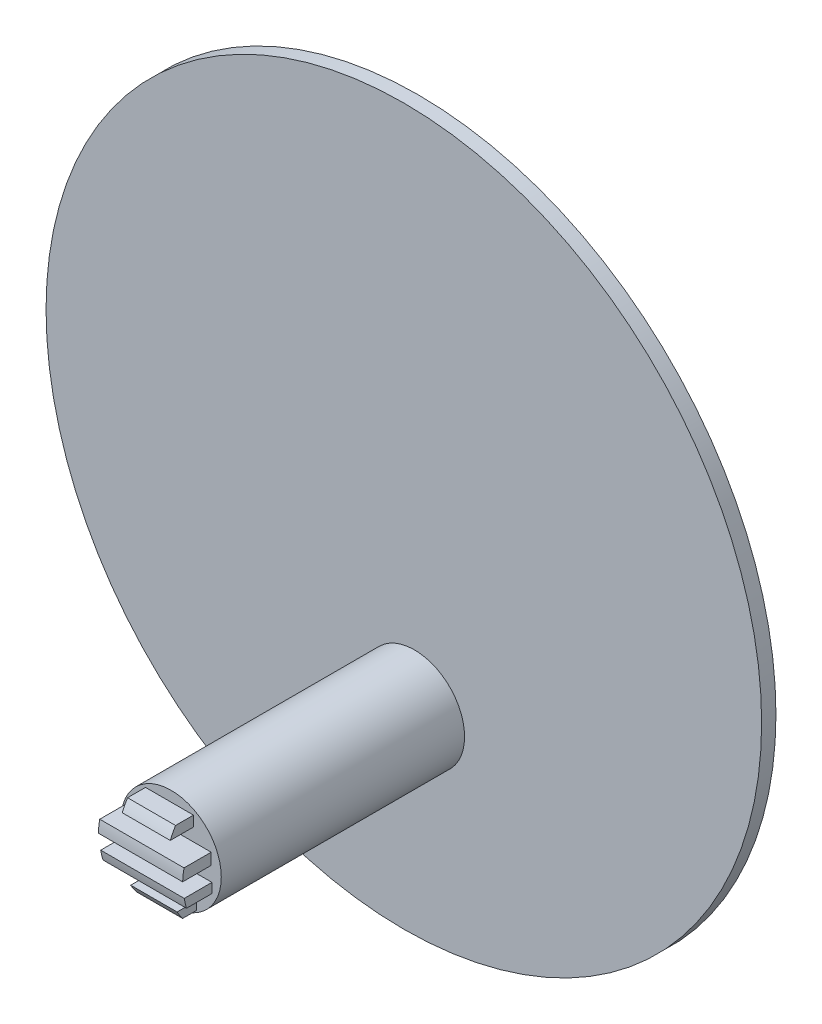
ISO-10303-21;
HEADER;
FILE_DESCRIPTION(('STEP AP214'),'2;1');
FILE_NAME('part.step','',(''),(''),'','','');
FILE_SCHEMA(('AUTOMOTIVE_DESIGN { 1 0 10303 214 1 1 1 1 }'));
ENDSEC;
DATA;
#1=APPLICATION_CONTEXT('core data for automotive mechanical design processes');
#2=APPLICATION_PROTOCOL_DEFINITION('international standard','automotive_design',2000,#1);
#3=PRODUCT_CONTEXT('',#1,'mechanical');
#4=PRODUCT('Part','Part','',(#3));
#5=PRODUCT_RELATED_PRODUCT_CATEGORY('part','',(#4));
#6=PRODUCT_DEFINITION_FORMATION('','',#4);
#7=PRODUCT_DEFINITION_CONTEXT('part definition',#1,'design');
#8=PRODUCT_DEFINITION('design','',#6,#7);
#9=PRODUCT_DEFINITION_SHAPE('','',#8);
#10=(LENGTH_UNIT() NAMED_UNIT(*) SI_UNIT(.MILLI.,.METRE.));
#11=(NAMED_UNIT(*) PLANE_ANGLE_UNIT() SI_UNIT($,.RADIAN.));
#12=(NAMED_UNIT(*) SI_UNIT($,.STERADIAN.) SOLID_ANGLE_UNIT());
#13=UNCERTAINTY_MEASURE_WITH_UNIT(LENGTH_MEASURE(1.E-05),#10,'distance_accuracy_value','');
#14=(GEOMETRIC_REPRESENTATION_CONTEXT(3) GLOBAL_UNCERTAINTY_ASSIGNED_CONTEXT((#13)) GLOBAL_UNIT_ASSIGNED_CONTEXT((#10,
#11,#12)) REPRESENTATION_CONTEXT('',''));
#15=CARTESIAN_POINT('',(0.,0.,0.));
#16=DIRECTION('',(0.,0.,1.));
#17=DIRECTION('',(1.,0.,0.));
#18=AXIS2_PLACEMENT_3D('',#15,#16,#17);
#19=CARTESIAN_POINT('',(0.,0.,7.2));
#20=DIRECTION('',(0.,0.,-1.));
#21=DIRECTION('',(-1.,0.,0.));
#22=AXIS2_PLACEMENT_3D('',#19,#20,#21);
#23=PLANE('',#22);
#24=DIRECTION('',(0.,-1.,0.));
#25=VECTOR('',#24,1.);
#26=CARTESIAN_POINT('',(-6.47399386491543,-5.63930071174923,7.2));
#27=LINE('',#26,#25);
#28=CARTESIAN_POINT('',(-6.47399386491543,-5.40496326618722,7.2));
#29=VERTEX_POINT('',#28);
#30=CARTESIAN_POINT('',(-6.47399386491543,-5.63930071174923,7.2));
#31=VERTEX_POINT('',#30);
#32=EDGE_CURVE('E92',#29,#31,#27,.T.);
#33=ORIENTED_EDGE('',*,*,#32,.F.);
#34=DIRECTION('',(-1.,0.,0.));
#35=VECTOR('',#34,1.);
#36=CARTESIAN_POINT('',(-6.47399386491543,-5.40496326618722,7.2));
#37=LINE('',#36,#35);
#38=CARTESIAN_POINT('',(-5.17719290678542,-5.40496326618722,7.2));
#39=VERTEX_POINT('',#38);
#40=EDGE_CURVE('E103',#39,#29,#37,.T.);
#41=ORIENTED_EDGE('',*,*,#40,.F.);
#42=DIRECTION('',(0.,1.,0.));
#43=VECTOR('',#42,1.);
#44=CARTESIAN_POINT('',(-5.17719290678542,-5.63930071174923,7.2));
#45=LINE('',#44,#43);
#46=CARTESIAN_POINT('',(-5.17719290678542,-5.63930071174923,7.2));
#47=VERTEX_POINT('',#46);
#48=EDGE_CURVE('E94',#47,#39,#45,.T.);
#49=ORIENTED_EDGE('',*,*,#48,.F.);
#50=DIRECTION('',(1.,0.,0.));
#51=VECTOR('',#50,1.);
#52=CARTESIAN_POINT('',(-6.47399386491543,-5.63930071174923,7.2));
#53=LINE('',#52,#51);
#54=EDGE_CURVE('E84',#31,#47,#53,.T.);
#55=ORIENTED_EDGE('',*,*,#54,.F.);
#56=EDGE_LOOP('',(#33,#41,#49,#55));
#57=FACE_BOUND('',#56,.T.);
#58=ADVANCED_FACE('F43',(#57),#23,.T.);
#59=CARTESIAN_POINT('',(-6.47399386491543,-5.40496326618722,8.001));
#60=DIRECTION('',(0.,-1.,0.));
#61=DIRECTION('',(0.,0.,-1.));
#62=AXIS2_PLACEMENT_3D('',#59,#60,#61);
#63=PLANE('',#62);
#64=DIRECTION('',(0.,0.,-1.));
#65=VECTOR('',#64,1.);
#66=CARTESIAN_POINT('',(-6.47399386491543,-5.40496326618722,8.001));
#67=LINE('',#66,#65);
#68=CARTESIAN_POINT('',(-6.47399386491543,-5.40496326618722,7.74464136293762));
#69=VERTEX_POINT('',#68);
#70=EDGE_CURVE('E97',#69,#29,#67,.T.);
#71=ORIENTED_EDGE('',*,*,#70,.F.);
#72=DIRECTION('',(1.,0.,0.));
#73=VECTOR('',#72,1.);
#74=CARTESIAN_POINT('',(-7.31702514116261,-5.40496326618722,7.74464136293762));
#75=LINE('',#74,#73);
#76=CARTESIAN_POINT('',(-5.17719290678542,-5.40496326618722,7.74464136293762));
#77=VERTEX_POINT('',#76);
#78=EDGE_CURVE('E47',#69,#77,#75,.T.);
#79=ORIENTED_EDGE('',*,*,#78,.T.);
#80=DIRECTION('',(0.,0.,-1.));
#81=VECTOR('',#80,1.);
#82=CARTESIAN_POINT('',(-5.17719290678542,-5.40496326618722,8.001));
#83=LINE('',#82,#81);
#84=EDGE_CURVE('E106',#77,#39,#83,.T.);
#85=ORIENTED_EDGE('',*,*,#84,.T.);
#86=ORIENTED_EDGE('',*,*,#40,.T.);
#87=EDGE_LOOP('',(#71,#79,#85,#86));
#88=FACE_BOUND('',#87,.T.);
#89=ADVANCED_FACE('F116',(#88),#63,.F.);
#90=CARTESIAN_POINT('',(-5.17719290678542,-5.63930071174923,8.001));
#91=DIRECTION('',(-1.,0.,0.));
#92=DIRECTION('',(0.,0.,1.));
#93=AXIS2_PLACEMENT_3D('',#90,#91,#92);
#94=PLANE('',#93);
#95=ORIENTED_EDGE('',*,*,#84,.F.);
#96=CARTESIAN_POINT('',(-5.17719290678542,-4.42709491373523,6.));
#97=DIRECTION('',(-1.,0.,0.));
#98=DIRECTION('',(0.,0.,1.));
#99=AXIS2_PLACEMENT_3D('',#96,#97,#98);
#100=CIRCLE('',#99,2.);
#101=CARTESIAN_POINT('',(-5.17719290678542,-5.63930071174923,7.59077248632897));
#102=VERTEX_POINT('',#101);
#103=EDGE_CURVE('E112',#77,#102,#100,.F.);
#104=ORIENTED_EDGE('',*,*,#103,.T.);
#105=DIRECTION('',(0.,0.,-1.));
#106=VECTOR('',#105,1.);
#107=CARTESIAN_POINT('',(-5.17719290678542,-5.63930071174923,8.001));
#108=LINE('',#107,#106);
#109=EDGE_CURVE('E88',#102,#47,#108,.T.);
#110=ORIENTED_EDGE('',*,*,#109,.T.);
#111=ORIENTED_EDGE('',*,*,#48,.T.);
#112=EDGE_LOOP('',(#95,#104,#110,#111));
#113=FACE_BOUND('',#112,.T.);
#114=ADVANCED_FACE('F111',(#113),#94,.F.);
#115=CARTESIAN_POINT('',(-6.47399386491543,-5.63930071174923,8.001));
#116=DIRECTION('',(0.,1.,0.));
#117=DIRECTION('',(0.,0.,1.));
#118=AXIS2_PLACEMENT_3D('',#115,#116,#117);
#119=PLANE('',#118);
#120=ORIENTED_EDGE('',*,*,#109,.F.);
#121=DIRECTION('',(1.,0.,0.));
#122=VECTOR('',#121,1.);
#123=CARTESIAN_POINT('',(-7.31702514116261,-5.63930071174923,7.59077248632897));
#124=LINE('',#123,#122);
#125=CARTESIAN_POINT('',(-6.47399386491543,-5.63930071174923,7.59077248632897));
#126=VERTEX_POINT('',#125);
#127=EDGE_CURVE('E52',#102,#126,#124,.F.);
#128=ORIENTED_EDGE('',*,*,#127,.T.);
#129=DIRECTION('',(0.,0.,-1.));
#130=VECTOR('',#129,1.);
#131=CARTESIAN_POINT('',(-6.47399386491543,-5.63930071174923,8.001));
#132=LINE('',#131,#130);
#133=EDGE_CURVE('E81',#126,#31,#132,.T.);
#134=ORIENTED_EDGE('',*,*,#133,.T.);
#135=ORIENTED_EDGE('',*,*,#54,.T.);
#136=EDGE_LOOP('',(#120,#128,#134,#135));
#137=FACE_BOUND('',#136,.T.);
#138=ADVANCED_FACE('F83',(#137),#119,.F.);
#139=CARTESIAN_POINT('',(-6.47399386491543,-5.63930071174923,8.001));
#140=DIRECTION('',(1.,0.,0.));
#141=DIRECTION('',(0.,0.,-1.));
#142=AXIS2_PLACEMENT_3D('',#139,#140,#141);
#143=PLANE('',#142);
#144=ORIENTED_EDGE('',*,*,#133,.F.);
#145=CARTESIAN_POINT('',(-6.47399386491543,-4.42709491373523,6.));
#146=DIRECTION('',(1.,0.,0.));
#147=DIRECTION('',(0.,0.,-1.));
#148=AXIS2_PLACEMENT_3D('',#145,#146,#147);
#149=CIRCLE('',#148,2.);
#150=EDGE_CURVE('E12',#126,#69,#149,.F.);
#151=ORIENTED_EDGE('',*,*,#150,.T.);
#152=ORIENTED_EDGE('',*,*,#70,.T.);
#153=ORIENTED_EDGE('',*,*,#32,.T.);
#154=EDGE_LOOP('',(#144,#151,#152,#153));
#155=FACE_BOUND('',#154,.T.);
#156=ADVANCED_FACE('F45',(#155),#143,.F.);
#157=CARTESIAN_POINT('',(-7.31702514116261,-4.42709491373523,6.));
#158=DIRECTION('',(1.,0.,0.));
#159=DIRECTION('',(0.,1.,0.));
#160=AXIS2_PLACEMENT_3D('',#157,#158,#159);
#161=CYLINDRICAL_SURFACE('',#160,2.);
#162=ORIENTED_EDGE('',*,*,#127,.F.);
#163=ORIENTED_EDGE('',*,*,#103,.F.);
#164=ORIENTED_EDGE('',*,*,#78,.F.);
#165=ORIENTED_EDGE('',*,*,#150,.F.);
#166=EDGE_LOOP('',(#162,#163,#164,#165));
#167=FACE_BOUND('',#166,.T.);
#168=ADVANCED_FACE('F117',(#167),#161,.T.);
#169=CLOSED_SHELL('',(#58,#89,#114,#138,#156,#168));
#170=MANIFOLD_SOLID_BREP('B2',#169);
#171=CARTESIAN_POINT('',(-5.88693479915037,-4.48808972646475,7.2));
#172=DIRECTION('',(0.,0.,1.));
#173=DIRECTION('',(1.,0.,0.));
#174=AXIS2_PLACEMENT_3D('',#171,#172,#173);
#175=PLANE('',#174);
#176=DIRECTION('',(0.,-1.,0.));
#177=VECTOR('',#176,1.);
#178=CARTESIAN_POINT('',(-7.12447589671683,-4.34483042021583,7.2));
#179=LINE('',#178,#177);
#180=CARTESIAN_POINT('',(-7.12447589671683,-4.02618887260431,7.2));
#181=VERTEX_POINT('',#180);
#182=CARTESIAN_POINT('',(-7.12447589671683,-4.34483042021583,7.2));
#183=VERTEX_POINT('',#182);
#184=EDGE_CURVE('E303',#181,#183,#179,.T.);
#185=ORIENTED_EDGE('',*,*,#184,.F.);
#186=DIRECTION('',(-1.,0.,0.));
#187=VECTOR('',#186,1.);
#188=CARTESIAN_POINT('',(-7.12447589671683,-4.02618887260431,7.2));
#189=LINE('',#188,#187);
#190=CARTESIAN_POINT('',(-4.76860853797234,-4.02618887260431,7.2));
#191=VERTEX_POINT('',#190);
#192=EDGE_CURVE('E190',#191,#181,#189,.T.);
#193=ORIENTED_EDGE('',*,*,#192,.F.);
#194=DIRECTION('',(0.,1.,0.));
#195=VECTOR('',#194,1.);
#196=CARTESIAN_POINT('',(-4.76860853797234,-4.34483042021583,7.2));
#197=LINE('',#196,#195);
#198=CARTESIAN_POINT('',(-4.76860853797234,-4.34483042021583,7.2));
#199=VERTEX_POINT('',#198);
#200=EDGE_CURVE('E310',#199,#191,#197,.T.);
#201=ORIENTED_EDGE('',*,*,#200,.F.);
#202=DIRECTION('',(1.,0.,0.));
#203=VECTOR('',#202,1.);
#204=CARTESIAN_POINT('',(-7.12447589671683,-4.34483042021583,7.2));
#205=LINE('',#204,#203);
#206=EDGE_CURVE('E306',#183,#199,#205,.T.);
#207=ORIENTED_EDGE('',*,*,#206,.F.);
#208=EDGE_LOOP('',(#185,#193,#201,#207));
#209=FACE_BOUND('',#208,.T.);
#210=CARTESIAN_POINT('',(-5.88693479915037,-4.48808972646475,7.2));
#211=DIRECTION('',(0.,0.,1.));
#212=DIRECTION('',(1.,0.,0.));
#213=AXIS2_PLACEMENT_3D('',#210,#211,#212);
#214=CIRCLE('',#213,1.4);
#215=CARTESIAN_POINT('',(-4.48693479915037,-4.48808972646475,7.2));
#216=VERTEX_POINT('',#215);
#217=EDGE_CURVE('E356',#216,#216,#214,.T.);
#218=ORIENTED_EDGE('',*,*,#217,.T.);
#219=EDGE_LOOP('',(#218));
#220=FACE_BOUND('',#219,.T.);
#221=DIRECTION('',(0.,-1.,0.));
#222=VECTOR('',#221,1.);
#223=CARTESIAN_POINT('',(-7.0818752006403,-5.01653067831498,7.2));
#224=LINE('',#223,#222);
#225=CARTESIAN_POINT('',(-7.0818752006403,-4.74615930139244,7.2));
#226=VERTEX_POINT('',#225);
#227=CARTESIAN_POINT('',(-7.0818752006403,-5.01653067831498,7.2));
#228=VERTEX_POINT('',#227);
#229=EDGE_CURVE('E302',#226,#228,#224,.T.);
#230=ORIENTED_EDGE('',*,*,#229,.F.);
#231=DIRECTION('',(-1.,0.,0.));
#232=VECTOR('',#231,1.);
#233=CARTESIAN_POINT('',(-7.0818752006403,-4.74615930139244,7.2));
#234=LINE('',#233,#232);
#235=CARTESIAN_POINT('',(-4.74740136473883,-4.74615930139244,7.2));
#236=VERTEX_POINT('',#235);
#237=EDGE_CURVE('E343',#236,#226,#234,.T.);
#238=ORIENTED_EDGE('',*,*,#237,.F.);
#239=DIRECTION('',(0.,1.,0.));
#240=VECTOR('',#239,1.);
#241=CARTESIAN_POINT('',(-4.74740136473883,-5.01653067831498,7.2));
#242=LINE('',#241,#240);
#243=CARTESIAN_POINT('',(-4.74740136473883,-5.01653067831498,7.2));
#244=VERTEX_POINT('',#243);
#245=EDGE_CURVE('E340',#244,#236,#242,.T.);
#246=ORIENTED_EDGE('',*,*,#245,.F.);
#247=DIRECTION('',(1.,0.,0.));
#248=VECTOR('',#247,1.);
#249=CARTESIAN_POINT('',(-7.0818752006403,-5.01653067831498,7.2));
#250=LINE('',#249,#248);
#251=EDGE_CURVE('E337',#228,#244,#250,.T.);
#252=ORIENTED_EDGE('',*,*,#251,.F.);
#253=EDGE_LOOP('',(#230,#238,#246,#252));
#254=FACE_BOUND('',#253,.T.);
#255=DIRECTION('',(0.,-1.,0.));
#256=VECTOR('',#255,1.);
#257=CARTESIAN_POINT('',(-6.60495390189908,-3.66508180899672,7.2));
#258=LINE('',#257,#256);
#259=CARTESIAN_POINT('',(-6.60495390189908,-3.37585901422699,7.2));
#260=VERTEX_POINT('',#259);
#261=CARTESIAN_POINT('',(-6.60495390189908,-3.66508180899672,7.2));
#262=VERTEX_POINT('',#261);
#263=EDGE_CURVE('E273',#260,#262,#258,.T.);
#264=ORIENTED_EDGE('',*,*,#263,.F.);
#265=DIRECTION('',(-1.,0.,0.));
#266=VECTOR('',#265,1.);
#267=CARTESIAN_POINT('',(-6.60495390189908,-3.37585901422699,7.2));
#268=LINE('',#267,#266);
#269=CARTESIAN_POINT('',(-5.263629897172,-3.37585901422699,7.2));
#270=VERTEX_POINT('',#269);
#271=EDGE_CURVE('E182',#270,#260,#268,.T.);
#272=ORIENTED_EDGE('',*,*,#271,.F.);
#273=DIRECTION('',(0.,1.,0.));
#274=VECTOR('',#273,1.);
#275=CARTESIAN_POINT('',(-5.263629897172,-3.66508180899672,7.2));
#276=LINE('',#275,#274);
#277=CARTESIAN_POINT('',(-5.263629897172,-3.66508180899672,7.2));
#278=VERTEX_POINT('',#277);
#279=EDGE_CURVE('E279',#278,#270,#276,.T.);
#280=ORIENTED_EDGE('',*,*,#279,.F.);
#281=DIRECTION('',(1.,0.,0.));
#282=VECTOR('',#281,1.);
#283=CARTESIAN_POINT('',(-6.60495390189908,-3.66508180899672,7.2));
#284=LINE('',#283,#282);
#285=EDGE_CURVE('E264',#262,#278,#284,.T.);
#286=ORIENTED_EDGE('',*,*,#285,.F.);
#287=EDGE_LOOP('',(#264,#272,#280,#286));
#288=FACE_BOUND('',#287,.T.);
#289=ADVANCED_FACE('F167',(#209,#220,#254,#288),#175,.T.);
#290=CARTESIAN_POINT('',(-6.18437235502239,0.,0.4));
#291=DIRECTION('',(0.,0.,1.));
#292=DIRECTION('',(1.,0.,0.));
#293=AXIS2_PLACEMENT_3D('',#290,#291,#292);
#294=PLANE('',#293);
#295=CARTESIAN_POINT('',(-6.18437235502239,0.,0.4));
#296=DIRECTION('',(0.,0.,1.));
#297=DIRECTION('',(1.,0.,0.));
#298=AXIS2_PLACEMENT_3D('',#295,#296,#297);
#299=CIRCLE('',#298,10.);
#300=CARTESIAN_POINT('',(3.81562764497761,0.,0.4));
#301=VERTEX_POINT('',#300);
#302=EDGE_CURVE('E41',#301,#301,#299,.T.);
#303=ORIENTED_EDGE('',*,*,#302,.T.);
#304=EDGE_LOOP('',(#303));
#305=FACE_BOUND('',#304,.T.);
#306=CARTESIAN_POINT('',(-5.88693479915037,-4.48808972646475,0.4));
#307=DIRECTION('',(0.,0.,1.));
#308=DIRECTION('',(1.,0.,0.));
#309=AXIS2_PLACEMENT_3D('',#306,#307,#308);
#310=CIRCLE('',#309,1.4);
#311=CARTESIAN_POINT('',(-4.48693479915037,-4.48808972646475,0.4));
#312=VERTEX_POINT('',#311);
#313=EDGE_CURVE('E334',#312,#312,#310,.T.);
#314=ORIENTED_EDGE('',*,*,#313,.F.);
#315=EDGE_LOOP('',(#314));
#316=FACE_BOUND('',#315,.T.);
#317=ADVANCED_FACE('F364',(#305,#316),#294,.T.);
#318=CARTESIAN_POINT('',(-6.18437235502239,0.,0.4));
#319=DIRECTION('',(0.,0.,-1.));
#320=DIRECTION('',(-1.,0.,0.));
#321=AXIS2_PLACEMENT_3D('',#318,#319,#320);
#322=CYLINDRICAL_SURFACE('',#321,10.);
#323=ORIENTED_EDGE('',*,*,#302,.F.);
#324=EDGE_LOOP('',(#323));
#325=FACE_BOUND('',#324,.T.);
#326=CARTESIAN_POINT('',(-6.18437235502239,0.,0.));
#327=DIRECTION('',(0.,0.,1.));
#328=DIRECTION('',(1.,0.,0.));
#329=AXIS2_PLACEMENT_3D('',#326,#327,#328);
#330=CIRCLE('',#329,10.);
#331=CARTESIAN_POINT('',(3.81562764497761,0.,0.));
#332=VERTEX_POINT('',#331);
#333=EDGE_CURVE('E171',#332,#332,#330,.T.);
#334=ORIENTED_EDGE('',*,*,#333,.T.);
#335=EDGE_LOOP('',(#334));
#336=FACE_BOUND('',#335,.T.);
#337=ADVANCED_FACE('F169',(#325,#336),#322,.T.);
#338=CARTESIAN_POINT('',(-6.18437235502239,0.,0.));
#339=DIRECTION('',(0.,0.,1.));
#340=DIRECTION('',(1.,0.,0.));
#341=AXIS2_PLACEMENT_3D('',#338,#339,#340);
#342=PLANE('',#341);
#343=ORIENTED_EDGE('',*,*,#333,.F.);
#344=EDGE_LOOP('',(#343));
#345=FACE_BOUND('',#344,.T.);
#346=ADVANCED_FACE('F372',(#345),#342,.F.);
#347=CARTESIAN_POINT('',(-5.88693479915037,-4.48808972646475,7.2));
#348=DIRECTION('',(0.,0.,-1.));
#349=DIRECTION('',(-1.,0.,0.));
#350=AXIS2_PLACEMENT_3D('',#347,#348,#349);
#351=CYLINDRICAL_SURFACE('',#350,1.4);
#352=ORIENTED_EDGE('',*,*,#217,.F.);
#353=EDGE_LOOP('',(#352));
#354=FACE_BOUND('',#353,.T.);
#355=ORIENTED_EDGE('',*,*,#313,.T.);
#356=EDGE_LOOP('',(#355));
#357=FACE_BOUND('',#356,.T.);
#358=ADVANCED_FACE('F362',(#354,#357),#351,.T.);
#359=CARTESIAN_POINT('',(-7.0818752006403,-4.74615930139244,8.001));
#360=DIRECTION('',(0.,-1.,0.));
#361=DIRECTION('',(0.,0.,-1.));
#362=AXIS2_PLACEMENT_3D('',#359,#360,#361);
#363=PLANE('',#362);
#364=DIRECTION('',(0.,0.,-1.));
#365=VECTOR('',#364,1.);
#366=CARTESIAN_POINT('',(-7.0818752006403,-4.74615930139244,8.001));
#367=LINE('',#366,#365);
#368=CARTESIAN_POINT('',(-7.0818752006403,-4.74615930139244,7.97438545287614));
#369=VERTEX_POINT('',#368);
#370=EDGE_CURVE('E345',#369,#226,#367,.T.);
#371=ORIENTED_EDGE('',*,*,#370,.F.);
#372=DIRECTION('',(1.,0.,0.));
#373=VECTOR('',#372,1.);
#374=CARTESIAN_POINT('',(-7.31702514116261,-4.74615930139244,7.97438545287614));
#375=LINE('',#374,#373);
#376=CARTESIAN_POINT('',(-4.74740136473883,-4.74615930139244,7.97438545287614));
#377=VERTEX_POINT('',#376);
#378=EDGE_CURVE('E328',#369,#377,#375,.T.);
#379=ORIENTED_EDGE('',*,*,#378,.T.);
#380=DIRECTION('',(0.,0.,-1.));
#381=VECTOR('',#380,1.);
#382=CARTESIAN_POINT('',(-4.74740136473883,-4.74615930139244,8.001));
#383=LINE('',#382,#381);
#384=EDGE_CURVE('E348',#377,#236,#383,.T.);
#385=ORIENTED_EDGE('',*,*,#384,.T.);
#386=ORIENTED_EDGE('',*,*,#237,.T.);
#387=EDGE_LOOP('',(#371,#379,#385,#386));
#388=FACE_BOUND('',#387,.T.);
#389=ADVANCED_FACE('F382',(#388),#363,.F.);
#390=CARTESIAN_POINT('',(-4.74740136473883,-5.01653067831498,8.001));
#391=DIRECTION('',(-1.,0.,0.));
#392=DIRECTION('',(0.,0.,1.));
#393=AXIS2_PLACEMENT_3D('',#390,#391,#392);
#394=PLANE('',#393);
#395=ORIENTED_EDGE('',*,*,#384,.F.);
#396=CARTESIAN_POINT('',(-4.74740136473883,-4.42709491373523,6.));
#397=DIRECTION('',(-1.,0.,0.));
#398=DIRECTION('',(0.,0.,1.));
#399=AXIS2_PLACEMENT_3D('',#396,#397,#398);
#400=CIRCLE('',#399,2.);
#401=CARTESIAN_POINT('',(-4.74740136473883,-5.01653067831498,7.9111686161703));
#402=VERTEX_POINT('',#401);
#403=EDGE_CURVE('E324',#377,#402,#400,.F.);
#404=ORIENTED_EDGE('',*,*,#403,.T.);
#405=DIRECTION('',(0.,0.,-1.));
#406=VECTOR('',#405,1.);
#407=CARTESIAN_POINT('',(-4.74740136473883,-5.01653067831498,8.001));
#408=LINE('',#407,#406);
#409=EDGE_CURVE('E350',#402,#244,#408,.T.);
#410=ORIENTED_EDGE('',*,*,#409,.T.);
#411=ORIENTED_EDGE('',*,*,#245,.T.);
#412=EDGE_LOOP('',(#395,#404,#410,#411));
#413=FACE_BOUND('',#412,.T.);
#414=ADVANCED_FACE('F390',(#413),#394,.F.);
#415=CARTESIAN_POINT('',(-7.0818752006403,-5.01653067831498,8.001));
#416=DIRECTION('',(0.,1.,0.));
#417=DIRECTION('',(0.,0.,1.));
#418=AXIS2_PLACEMENT_3D('',#415,#416,#417);
#419=PLANE('',#418);
#420=ORIENTED_EDGE('',*,*,#409,.F.);
#421=DIRECTION('',(1.,0.,0.));
#422=VECTOR('',#421,1.);
#423=CARTESIAN_POINT('',(-7.31702514116261,-5.01653067831498,7.9111686161703));
#424=LINE('',#423,#422);
#425=CARTESIAN_POINT('',(-7.0818752006403,-5.01653067831498,7.9111686161703));
#426=VERTEX_POINT('',#425);
#427=EDGE_CURVE('E327',#402,#426,#424,.F.);
#428=ORIENTED_EDGE('',*,*,#427,.T.);
#429=DIRECTION('',(0.,0.,-1.));
#430=VECTOR('',#429,1.);
#431=CARTESIAN_POINT('',(-7.0818752006403,-5.01653067831498,8.001));
#432=LINE('',#431,#430);
#433=EDGE_CURVE('E352',#426,#228,#432,.T.);
#434=ORIENTED_EDGE('',*,*,#433,.T.);
#435=ORIENTED_EDGE('',*,*,#251,.T.);
#436=EDGE_LOOP('',(#420,#428,#434,#435));
#437=FACE_BOUND('',#436,.T.);
#438=ADVANCED_FACE('F408',(#437),#419,.F.);
#439=CARTESIAN_POINT('',(-7.0818752006403,-5.01653067831498,8.001));
#440=DIRECTION('',(1.,0.,0.));
#441=DIRECTION('',(0.,0.,-1.));
#442=AXIS2_PLACEMENT_3D('',#439,#440,#441);
#443=PLANE('',#442);
#444=ORIENTED_EDGE('',*,*,#433,.F.);
#445=CARTESIAN_POINT('',(-7.0818752006403,-4.42709491373523,6.));
#446=DIRECTION('',(1.,0.,0.));
#447=DIRECTION('',(0.,0.,-1.));
#448=AXIS2_PLACEMENT_3D('',#445,#446,#447);
#449=CIRCLE('',#448,2.);
#450=EDGE_CURVE('E331',#426,#369,#449,.F.);
#451=ORIENTED_EDGE('',*,*,#450,.T.);
#452=ORIENTED_EDGE('',*,*,#370,.T.);
#453=ORIENTED_EDGE('',*,*,#229,.T.);
#454=EDGE_LOOP('',(#444,#451,#452,#453));
#455=FACE_BOUND('',#454,.T.);
#456=ADVANCED_FACE('F402',(#455),#443,.F.);
#457=CARTESIAN_POINT('',(-7.31702514116261,-4.42709491373523,6.));
#458=DIRECTION('',(1.,0.,0.));
#459=DIRECTION('',(0.,1.,0.));
#460=AXIS2_PLACEMENT_3D('',#457,#458,#459);
#461=CYLINDRICAL_SURFACE('',#460,2.);
#462=ORIENTED_EDGE('',*,*,#427,.F.);
#463=ORIENTED_EDGE('',*,*,#403,.F.);
#464=ORIENTED_EDGE('',*,*,#378,.F.);
#465=ORIENTED_EDGE('',*,*,#450,.F.);
#466=EDGE_LOOP('',(#462,#463,#464,#465));
#467=FACE_BOUND('',#466,.T.);
#468=ADVANCED_FACE('F410',(#467),#461,.T.);
#469=CARTESIAN_POINT('',(-7.12447589671683,-4.02618887260431,8.001));
#470=DIRECTION('',(0.,-1.,0.));
#471=DIRECTION('',(0.,0.,-1.));
#472=AXIS2_PLACEMENT_3D('',#469,#470,#471);
#473=PLANE('',#472);
#474=DIRECTION('',(0.,0.,-1.));
#475=VECTOR('',#474,1.);
#476=CARTESIAN_POINT('',(-7.12447589671683,-4.02618887260431,8.001));
#477=LINE('',#476,#475);
#478=CARTESIAN_POINT('',(-7.12447589671683,-4.02618887260431,7.95940663114748));
#479=VERTEX_POINT('',#478);
#480=EDGE_CURVE('E314',#479,#181,#477,.T.);
#481=ORIENTED_EDGE('',*,*,#480,.F.);
#482=DIRECTION('',(1.,0.,0.));
#483=VECTOR('',#482,1.);
#484=CARTESIAN_POINT('',(-7.31702514116261,-4.02618887260431,7.95940663114748));
#485=LINE('',#484,#483);
#486=CARTESIAN_POINT('',(-4.76860853797234,-4.02618887260431,7.95940663114748));
#487=VERTEX_POINT('',#486);
#488=EDGE_CURVE('E296',#479,#487,#485,.T.);
#489=ORIENTED_EDGE('',*,*,#488,.T.);
#490=DIRECTION('',(0.,0.,-1.));
#491=VECTOR('',#490,1.);
#492=CARTESIAN_POINT('',(-4.76860853797234,-4.02618887260431,8.001));
#493=LINE('',#492,#491);
#494=EDGE_CURVE('E316',#487,#191,#493,.T.);
#495=ORIENTED_EDGE('',*,*,#494,.T.);
#496=ORIENTED_EDGE('',*,*,#192,.T.);
#497=EDGE_LOOP('',(#481,#489,#495,#496));
#498=FACE_BOUND('',#497,.T.);
#499=ADVANCED_FACE('F412',(#498),#473,.F.);
#500=CARTESIAN_POINT('',(-4.76860853797234,-4.34483042021583,8.001));
#501=DIRECTION('',(-1.,0.,0.));
#502=DIRECTION('',(0.,0.,1.));
#503=AXIS2_PLACEMENT_3D('',#500,#501,#502);
#504=PLANE('',#503);
#505=ORIENTED_EDGE('',*,*,#494,.F.);
#506=CARTESIAN_POINT('',(-4.76860853797234,-4.42709491373523,6.));
#507=DIRECTION('',(-1.,0.,0.));
#508=DIRECTION('',(0.,0.,1.));
#509=AXIS2_PLACEMENT_3D('',#506,#507,#508);
#510=CIRCLE('',#509,2.);
#511=CARTESIAN_POINT('',(-4.76860853797234,-4.34483042021583,7.99830742207149));
#512=VERTEX_POINT('',#511);
#513=EDGE_CURVE('E292',#487,#512,#510,.F.);
#514=ORIENTED_EDGE('',*,*,#513,.T.);
#515=DIRECTION('',(0.,0.,-1.));
#516=VECTOR('',#515,1.);
#517=CARTESIAN_POINT('',(-4.76860853797234,-4.34483042021583,8.001));
#518=LINE('',#517,#516);
#519=EDGE_CURVE('E318',#512,#199,#518,.T.);
#520=ORIENTED_EDGE('',*,*,#519,.T.);
#521=ORIENTED_EDGE('',*,*,#200,.T.);
#522=EDGE_LOOP('',(#505,#514,#520,#521));
#523=FACE_BOUND('',#522,.T.);
#524=ADVANCED_FACE('F418',(#523),#504,.F.);
#525=CARTESIAN_POINT('',(-7.12447589671683,-4.34483042021583,8.001));
#526=DIRECTION('',(0.,1.,0.));
#527=DIRECTION('',(0.,0.,1.));
#528=AXIS2_PLACEMENT_3D('',#525,#526,#527);
#529=PLANE('',#528);
#530=ORIENTED_EDGE('',*,*,#519,.F.);
#531=DIRECTION('',(1.,0.,0.));
#532=VECTOR('',#531,1.);
#533=CARTESIAN_POINT('',(-7.31702514116261,-4.34483042021583,7.99830742207149));
#534=LINE('',#533,#532);
#535=CARTESIAN_POINT('',(-7.12447589671683,-4.34483042021583,7.99830742207149));
#536=VERTEX_POINT('',#535);
#537=EDGE_CURVE('E295',#512,#536,#534,.F.);
#538=ORIENTED_EDGE('',*,*,#537,.T.);
#539=DIRECTION('',(0.,0.,-1.));
#540=VECTOR('',#539,1.);
#541=CARTESIAN_POINT('',(-7.12447589671683,-4.34483042021583,8.001));
#542=LINE('',#541,#540);
#543=EDGE_CURVE('E320',#536,#183,#542,.T.);
#544=ORIENTED_EDGE('',*,*,#543,.T.);
#545=ORIENTED_EDGE('',*,*,#206,.T.);
#546=EDGE_LOOP('',(#530,#538,#544,#545));
#547=FACE_BOUND('',#546,.T.);
#548=ADVANCED_FACE('F455',(#547),#529,.F.);
#549=CARTESIAN_POINT('',(-7.12447589671683,-4.34483042021583,8.001));
#550=DIRECTION('',(1.,0.,0.));
#551=DIRECTION('',(0.,0.,-1.));
#552=AXIS2_PLACEMENT_3D('',#549,#550,#551);
#553=PLANE('',#552);
#554=ORIENTED_EDGE('',*,*,#543,.F.);
#555=CARTESIAN_POINT('',(-7.12447589671683,-4.42709491373523,6.));
#556=DIRECTION('',(1.,0.,0.));
#557=DIRECTION('',(0.,0.,-1.));
#558=AXIS2_PLACEMENT_3D('',#555,#556,#557);
#559=CIRCLE('',#558,2.);
#560=EDGE_CURVE('E299',#536,#479,#559,.F.);
#561=ORIENTED_EDGE('',*,*,#560,.T.);
#562=ORIENTED_EDGE('',*,*,#480,.T.);
#563=ORIENTED_EDGE('',*,*,#184,.T.);
#564=EDGE_LOOP('',(#554,#561,#562,#563));
#565=FACE_BOUND('',#564,.T.);
#566=ADVANCED_FACE('F422',(#565),#553,.F.);
#567=CARTESIAN_POINT('',(-7.31702514116261,-4.42709491373523,6.));
#568=DIRECTION('',(1.,0.,0.));
#569=DIRECTION('',(0.,1.,0.));
#570=AXIS2_PLACEMENT_3D('',#567,#568,#569);
#571=CYLINDRICAL_SURFACE('',#570,2.);
#572=ORIENTED_EDGE('',*,*,#537,.F.);
#573=ORIENTED_EDGE('',*,*,#513,.F.);
#574=ORIENTED_EDGE('',*,*,#488,.F.);
#575=ORIENTED_EDGE('',*,*,#560,.F.);
#576=EDGE_LOOP('',(#572,#573,#574,#575));
#577=FACE_BOUND('',#576,.T.);
#578=ADVANCED_FACE('F473',(#577),#571,.T.);
#579=CARTESIAN_POINT('',(-6.60495390189908,-3.37585901422699,8.001));
#580=DIRECTION('',(0.,-1.,0.));
#581=DIRECTION('',(0.,0.,-1.));
#582=AXIS2_PLACEMENT_3D('',#579,#580,#581);
#583=PLANE('',#582);
#584=DIRECTION('',(0.,0.,-1.));
#585=VECTOR('',#584,1.);
#586=CARTESIAN_POINT('',(-6.60495390189908,-3.37585901422699,8.001));
#587=LINE('',#586,#585);
#588=CARTESIAN_POINT('',(-6.60495390189908,-3.37585901422699,7.70144147227728));
#589=VERTEX_POINT('',#588);
#590=EDGE_CURVE('E275',#589,#260,#587,.T.);
#591=ORIENTED_EDGE('',*,*,#590,.F.);
#592=DIRECTION('',(1.,0.,0.));
#593=VECTOR('',#592,1.);
#594=CARTESIAN_POINT('',(-7.31702514116261,-3.37585901422699,7.70144147227728));
#595=LINE('',#594,#593);
#596=CARTESIAN_POINT('',(-5.263629897172,-3.37585901422699,7.70144147227728));
#597=VERTEX_POINT('',#596);
#598=EDGE_CURVE('E269',#589,#597,#595,.T.);
#599=ORIENTED_EDGE('',*,*,#598,.T.);
#600=DIRECTION('',(0.,0.,-1.));
#601=VECTOR('',#600,1.);
#602=CARTESIAN_POINT('',(-5.263629897172,-3.37585901422699,8.001));
#603=LINE('',#602,#601);
#604=EDGE_CURVE('E286',#597,#270,#603,.T.);
#605=ORIENTED_EDGE('',*,*,#604,.T.);
#606=ORIENTED_EDGE('',*,*,#271,.T.);
#607=EDGE_LOOP('',(#591,#599,#605,#606));
#608=FACE_BOUND('',#607,.T.);
#609=ADVANCED_FACE('F482',(#608),#583,.F.);
#610=CARTESIAN_POINT('',(-5.263629897172,-3.66508180899672,8.001));
#611=DIRECTION('',(-1.,0.,0.));
#612=DIRECTION('',(0.,0.,1.));
#613=AXIS2_PLACEMENT_3D('',#610,#611,#612);
#614=PLANE('',#613);
#615=ORIENTED_EDGE('',*,*,#604,.F.);
#616=CARTESIAN_POINT('',(-5.263629897172,-4.42709491373523,6.));
#617=DIRECTION('',(-1.,0.,0.));
#618=DIRECTION('',(0.,0.,1.));
#619=AXIS2_PLACEMENT_3D('',#616,#617,#618);
#620=CIRCLE('',#619,2.);
#621=CARTESIAN_POINT('',(-5.263629897172,-3.66508180899672,7.84914467476365));
#622=VERTEX_POINT('',#621);
#623=EDGE_CURVE('E291',#597,#622,#620,.F.);
#624=ORIENTED_EDGE('',*,*,#623,.T.);
#625=DIRECTION('',(0.,0.,-1.));
#626=VECTOR('',#625,1.);
#627=CARTESIAN_POINT('',(-5.263629897172,-3.66508180899672,8.001));
#628=LINE('',#627,#626);
#629=EDGE_CURVE('E270',#622,#278,#628,.T.);
#630=ORIENTED_EDGE('',*,*,#629,.T.);
#631=ORIENTED_EDGE('',*,*,#279,.T.);
#632=EDGE_LOOP('',(#615,#624,#630,#631));
#633=FACE_BOUND('',#632,.T.);
#634=ADVANCED_FACE('F498',(#633),#614,.F.);
#635=CARTESIAN_POINT('',(-6.60495390189908,-3.66508180899672,8.001));
#636=DIRECTION('',(0.,1.,0.));
#637=DIRECTION('',(0.,0.,1.));
#638=AXIS2_PLACEMENT_3D('',#635,#636,#637);
#639=PLANE('',#638);
#640=ORIENTED_EDGE('',*,*,#629,.F.);
#641=DIRECTION('',(1.,0.,0.));
#642=VECTOR('',#641,1.);
#643=CARTESIAN_POINT('',(-7.31702514116261,-3.66508180899672,7.84914467476365));
#644=LINE('',#643,#642);
#645=CARTESIAN_POINT('',(-6.60495390189908,-3.66508180899672,7.84914467476365));
#646=VERTEX_POINT('',#645);
#647=EDGE_CURVE('E266',#622,#646,#644,.F.);
#648=ORIENTED_EDGE('',*,*,#647,.T.);
#649=DIRECTION('',(0.,0.,-1.));
#650=VECTOR('',#649,1.);
#651=CARTESIAN_POINT('',(-6.60495390189908,-3.66508180899672,8.001));
#652=LINE('',#651,#650);
#653=EDGE_CURVE('E259',#646,#262,#652,.T.);
#654=ORIENTED_EDGE('',*,*,#653,.T.);
#655=ORIENTED_EDGE('',*,*,#285,.T.);
#656=EDGE_LOOP('',(#640,#648,#654,#655));
#657=FACE_BOUND('',#656,.T.);
#658=ADVANCED_FACE('F262',(#657),#639,.F.);
#659=CARTESIAN_POINT('',(-6.60495390189908,-3.66508180899672,8.001));
#660=DIRECTION('',(1.,0.,0.));
#661=DIRECTION('',(0.,0.,-1.));
#662=AXIS2_PLACEMENT_3D('',#659,#660,#661);
#663=PLANE('',#662);
#664=ORIENTED_EDGE('',*,*,#653,.F.);
#665=CARTESIAN_POINT('',(-6.60495390189908,-4.42709491373523,6.));
#666=DIRECTION('',(1.,0.,0.));
#667=DIRECTION('',(0.,0.,-1.));
#668=AXIS2_PLACEMENT_3D('',#665,#666,#667);
#669=CIRCLE('',#668,2.);
#670=EDGE_CURVE('E307',#646,#589,#669,.F.);
#671=ORIENTED_EDGE('',*,*,#670,.T.);
#672=ORIENTED_EDGE('',*,*,#590,.T.);
#673=ORIENTED_EDGE('',*,*,#263,.T.);
#674=EDGE_LOOP('',(#664,#671,#672,#673));
#675=FACE_BOUND('',#674,.T.);
#676=ADVANCED_FACE('F274',(#675),#663,.F.);
#677=CARTESIAN_POINT('',(-7.31702514116261,-4.42709491373523,6.));
#678=DIRECTION('',(1.,0.,0.));
#679=DIRECTION('',(0.,1.,0.));
#680=AXIS2_PLACEMENT_3D('',#677,#678,#679);
#681=CYLINDRICAL_SURFACE('',#680,2.);
#682=ORIENTED_EDGE('',*,*,#647,.F.);
#683=ORIENTED_EDGE('',*,*,#623,.F.);
#684=ORIENTED_EDGE('',*,*,#598,.F.);
#685=ORIENTED_EDGE('',*,*,#670,.F.);
#686=EDGE_LOOP('',(#682,#683,#684,#685));
#687=FACE_BOUND('',#686,.T.);
#688=ADVANCED_FACE('F524',(#687),#681,.T.);
#689=CLOSED_SHELL('',(#289,#317,#337,#346,#358,#389,#414,#438,#456,#468,#499,#524,#548,#566,
#578,#609,#634,#658,#676,#688));
#690=MANIFOLD_SOLID_BREP('B6',#689);
#691=ADVANCED_BREP_SHAPE_REPRESENTATION('',(#18,#170,#690),#14);
#692=SHAPE_DEFINITION_REPRESENTATION(#9,#691);
ENDSEC;
END-ISO-10303-21;
